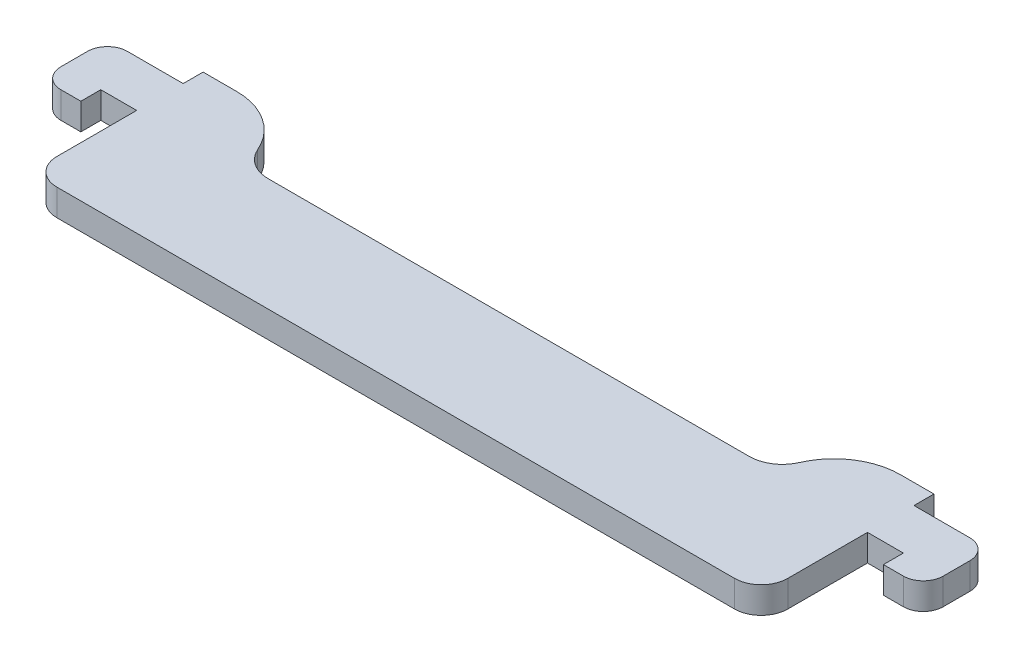
ISO-10303-21;
HEADER;
FILE_DESCRIPTION(('STEP AP214'),'2;1');
FILE_NAME('part.step','',(''),(''),'','','');
FILE_SCHEMA(('AUTOMOTIVE_DESIGN { 1 0 10303 214 1 1 1 1 }'));
ENDSEC;
DATA;
#1=APPLICATION_CONTEXT('core data for automotive mechanical design processes');
#2=APPLICATION_PROTOCOL_DEFINITION('international standard','automotive_design',2000,#1);
#3=PRODUCT_CONTEXT('',#1,'mechanical');
#4=PRODUCT('Part','Part','',(#3));
#5=PRODUCT_RELATED_PRODUCT_CATEGORY('part','',(#4));
#6=PRODUCT_DEFINITION_FORMATION('','',#4);
#7=PRODUCT_DEFINITION_CONTEXT('part definition',#1,'design');
#8=PRODUCT_DEFINITION('design','',#6,#7);
#9=PRODUCT_DEFINITION_SHAPE('','',#8);
#10=(LENGTH_UNIT() NAMED_UNIT(*) SI_UNIT(.MILLI.,.METRE.));
#11=(NAMED_UNIT(*) PLANE_ANGLE_UNIT() SI_UNIT($,.RADIAN.));
#12=(NAMED_UNIT(*) SI_UNIT($,.STERADIAN.) SOLID_ANGLE_UNIT());
#13=UNCERTAINTY_MEASURE_WITH_UNIT(LENGTH_MEASURE(1.E-05),#10,'distance_accuracy_value','');
#14=(GEOMETRIC_REPRESENTATION_CONTEXT(3) GLOBAL_UNCERTAINTY_ASSIGNED_CONTEXT((#13)) GLOBAL_UNIT_ASSIGNED_CONTEXT((#10,
#11,#12)) REPRESENTATION_CONTEXT('',''));
#15=CARTESIAN_POINT('',(0.,0.,0.));
#16=DIRECTION('',(0.,0.,1.));
#17=DIRECTION('',(1.,0.,0.));
#18=AXIS2_PLACEMENT_3D('',#15,#16,#17);
#19=CARTESIAN_POINT('',(0.,4.,-23.));
#20=DIRECTION('',(0.,0.,1.));
#21=DIRECTION('',(1.,0.,0.));
#22=AXIS2_PLACEMENT_3D('',#19,#20,#21);
#23=PLANE('',#22);
#24=DIRECTION('',(-1.,0.,0.));
#25=VECTOR('',#24,1.);
#26=CARTESIAN_POINT('',(0.,0.,-23.));
#27=LINE('',#26,#25);
#28=CARTESIAN_POINT('',(0.,0.,-23.));
#29=VERTEX_POINT('',#28);
#30=CARTESIAN_POINT('',(-8.4,0.,-23.));
#31=VERTEX_POINT('',#30);
#32=EDGE_CURVE('E282',#29,#31,#27,.T.);
#33=ORIENTED_EDGE('',*,*,#32,.T.);
#34=DIRECTION('',(0.,-1.,0.));
#35=VECTOR('',#34,1.);
#36=CARTESIAN_POINT('',(-8.4,4.,-23.));
#37=LINE('',#36,#35);
#38=CARTESIAN_POINT('',(-8.4,4.,-23.));
#39=VERTEX_POINT('',#38);
#40=EDGE_CURVE('E396',#31,#39,#37,.F.);
#41=ORIENTED_EDGE('',*,*,#40,.T.);
#42=DIRECTION('',(-1.,0.,0.));
#43=VECTOR('',#42,1.);
#44=CARTESIAN_POINT('',(0.,4.,-23.));
#45=LINE('',#44,#43);
#46=CARTESIAN_POINT('',(0.,4.,-23.));
#47=VERTEX_POINT('',#46);
#48=EDGE_CURVE('E325',#47,#39,#45,.T.);
#49=ORIENTED_EDGE('',*,*,#48,.F.);
#50=DIRECTION('',(0.,-1.,0.));
#51=VECTOR('',#50,1.);
#52=CARTESIAN_POINT('',(0.,4.,-23.));
#53=LINE('',#52,#51);
#54=EDGE_CURVE('E281',#47,#29,#53,.T.);
#55=ORIENTED_EDGE('',*,*,#54,.T.);
#56=EDGE_LOOP('',(#33,#41,#49,#55));
#57=FACE_BOUND('',#56,.T.);
#58=ADVANCED_FACE('F36',(#57),#23,.F.);
#59=CARTESIAN_POINT('',(-11.4,4.,-23.));
#60=DIRECTION('',(1.,0.,0.));
#61=DIRECTION('',(0.,0.,-1.));
#62=AXIS2_PLACEMENT_3D('',#59,#60,#61);
#63=PLANE('',#62);
#64=DIRECTION('',(0.,0.,1.));
#65=VECTOR('',#64,1.);
#66=CARTESIAN_POINT('',(-11.4,0.,-23.));
#67=LINE('',#66,#65);
#68=CARTESIAN_POINT('',(-11.4,0.,-20.));
#69=VERTEX_POINT('',#68);
#70=CARTESIAN_POINT('',(-11.4,0.,-16.));
#71=VERTEX_POINT('',#70);
#72=EDGE_CURVE('E285',#69,#71,#67,.T.);
#73=ORIENTED_EDGE('',*,*,#72,.T.);
#74=DIRECTION('',(0.,-1.,0.));
#75=VECTOR('',#74,1.);
#76=CARTESIAN_POINT('',(-11.4,4.,-16.));
#77=LINE('',#76,#75);
#78=CARTESIAN_POINT('',(-11.4,4.,-16.));
#79=VERTEX_POINT('',#78);
#80=EDGE_CURVE('E391',#71,#79,#77,.F.);
#81=ORIENTED_EDGE('',*,*,#80,.T.);
#82=DIRECTION('',(0.,0.,1.));
#83=VECTOR('',#82,1.);
#84=CARTESIAN_POINT('',(-11.4,4.,-23.));
#85=LINE('',#84,#83);
#86=CARTESIAN_POINT('',(-11.4,4.,-20.));
#87=VERTEX_POINT('',#86);
#88=EDGE_CURVE('E231',#87,#79,#85,.T.);
#89=ORIENTED_EDGE('',*,*,#88,.F.);
#90=DIRECTION('',(0.,-1.,0.));
#91=VECTOR('',#90,1.);
#92=CARTESIAN_POINT('',(-11.4,4.,-20.));
#93=LINE('',#92,#91);
#94=EDGE_CURVE('E388',#87,#69,#93,.T.);
#95=ORIENTED_EDGE('',*,*,#94,.T.);
#96=EDGE_LOOP('',(#73,#81,#89,#95));
#97=FACE_BOUND('',#96,.T.);
#98=ADVANCED_FACE('F461',(#97),#63,.F.);
#99=CARTESIAN_POINT('',(-11.4,4.,-13.));
#100=DIRECTION('',(0.,0.,-1.));
#101=DIRECTION('',(-1.,0.,0.));
#102=AXIS2_PLACEMENT_3D('',#99,#100,#101);
#103=PLANE('',#102);
#104=DIRECTION('',(1.,0.,0.));
#105=VECTOR('',#104,1.);
#106=CARTESIAN_POINT('',(-11.4,4.,-13.));
#107=LINE('',#106,#105);
#108=CARTESIAN_POINT('',(-8.4,4.,-13.));
#109=VERTEX_POINT('',#108);
#110=CARTESIAN_POINT('',(-5.4,4.,-13.));
#111=VERTEX_POINT('',#110);
#112=EDGE_CURVE('E218',#109,#111,#107,.T.);
#113=ORIENTED_EDGE('',*,*,#112,.F.);
#114=DIRECTION('',(0.,-1.,0.));
#115=VECTOR('',#114,1.);
#116=CARTESIAN_POINT('',(-8.4,4.,-13.));
#117=LINE('',#116,#115);
#118=CARTESIAN_POINT('',(-8.4,0.,-13.));
#119=VERTEX_POINT('',#118);
#120=EDGE_CURVE('E382',#109,#119,#117,.T.);
#121=ORIENTED_EDGE('',*,*,#120,.T.);
#122=DIRECTION('',(1.,0.,0.));
#123=VECTOR('',#122,1.);
#124=CARTESIAN_POINT('',(-11.4,0.,-13.));
#125=LINE('',#124,#123);
#126=CARTESIAN_POINT('',(-5.4,0.,-13.));
#127=VERTEX_POINT('',#126);
#128=EDGE_CURVE('E237',#119,#127,#125,.T.);
#129=ORIENTED_EDGE('',*,*,#128,.T.);
#130=DIRECTION('',(0.,-1.,0.));
#131=VECTOR('',#130,1.);
#132=CARTESIAN_POINT('',(-5.4,4.,-13.));
#133=LINE('',#132,#131);
#134=EDGE_CURVE('E234',#111,#127,#133,.T.);
#135=ORIENTED_EDGE('',*,*,#134,.F.);
#136=EDGE_LOOP('',(#113,#121,#129,#135));
#137=FACE_BOUND('',#136,.T.);
#138=ADVANCED_FACE('F235',(#137),#103,.F.);
#139=CARTESIAN_POINT('',(-5.4,4.,-13.));
#140=DIRECTION('',(-1.,0.,0.));
#141=DIRECTION('',(0.,0.,1.));
#142=AXIS2_PLACEMENT_3D('',#139,#140,#141);
#143=PLANE('',#142);
#144=DIRECTION('',(0.,0.,-1.));
#145=VECTOR('',#144,1.);
#146=CARTESIAN_POINT('',(-5.4,0.,-13.));
#147=LINE('',#146,#145);
#148=CARTESIAN_POINT('',(-5.4,0.,-16.));
#149=VERTEX_POINT('',#148);
#150=EDGE_CURVE('E289',#127,#149,#147,.T.);
#151=ORIENTED_EDGE('',*,*,#150,.T.);
#152=DIRECTION('',(0.,-1.,0.));
#153=VECTOR('',#152,1.);
#154=CARTESIAN_POINT('',(-5.4,4.,-16.));
#155=LINE('',#154,#153);
#156=CARTESIAN_POINT('',(-5.4,4.,-16.));
#157=VERTEX_POINT('',#156);
#158=EDGE_CURVE('E241',#157,#149,#155,.T.);
#159=ORIENTED_EDGE('',*,*,#158,.F.);
#160=DIRECTION('',(0.,0.,-1.));
#161=VECTOR('',#160,1.);
#162=CARTESIAN_POINT('',(-5.4,4.,-13.));
#163=LINE('',#162,#161);
#164=EDGE_CURVE('E223',#111,#157,#163,.T.);
#165=ORIENTED_EDGE('',*,*,#164,.F.);
#166=ORIENTED_EDGE('',*,*,#134,.T.);
#167=EDGE_LOOP('',(#151,#159,#165,#166));
#168=FACE_BOUND('',#167,.T.);
#169=ADVANCED_FACE('F243',(#168),#143,.F.);
#170=CARTESIAN_POINT('',(-5.4,4.,-16.));
#171=DIRECTION('',(0.,0.,-1.));
#172=DIRECTION('',(-1.,0.,0.));
#173=AXIS2_PLACEMENT_3D('',#170,#171,#172);
#174=PLANE('',#173);
#175=DIRECTION('',(1.,0.,0.));
#176=VECTOR('',#175,1.);
#177=CARTESIAN_POINT('',(-5.4,0.,-16.));
#178=LINE('',#177,#176);
#179=CARTESIAN_POINT('',(0.,0.,-16.));
#180=VERTEX_POINT('',#179);
#181=EDGE_CURVE('E291',#149,#180,#178,.T.);
#182=ORIENTED_EDGE('',*,*,#181,.T.);
#183=DIRECTION('',(0.,-1.,0.));
#184=VECTOR('',#183,1.);
#185=CARTESIAN_POINT('',(0.,4.,-16.));
#186=LINE('',#185,#184);
#187=CARTESIAN_POINT('',(0.,4.,-16.));
#188=VERTEX_POINT('',#187);
#189=EDGE_CURVE('E346',#188,#180,#186,.T.);
#190=ORIENTED_EDGE('',*,*,#189,.F.);
#191=DIRECTION('',(1.,0.,0.));
#192=VECTOR('',#191,1.);
#193=CARTESIAN_POINT('',(-5.4,4.,-16.));
#194=LINE('',#193,#192);
#195=EDGE_CURVE('E246',#157,#188,#194,.T.);
#196=ORIENTED_EDGE('',*,*,#195,.F.);
#197=ORIENTED_EDGE('',*,*,#158,.T.);
#198=EDGE_LOOP('',(#182,#190,#196,#197));
#199=FACE_BOUND('',#198,.T.);
#200=ADVANCED_FACE('F586',(#199),#174,.F.);
#201=CARTESIAN_POINT('',(0.,4.,-16.));
#202=DIRECTION('',(1.,0.,0.));
#203=DIRECTION('',(0.,0.,-1.));
#204=AXIS2_PLACEMENT_3D('',#201,#202,#203);
#205=PLANE('',#204);
#206=DIRECTION('',(0.,0.,1.));
#207=VECTOR('',#206,1.);
#208=CARTESIAN_POINT('',(0.,0.,-16.));
#209=LINE('',#208,#207);
#210=CARTESIAN_POINT('',(0.,0.,-4.));
#211=VERTEX_POINT('',#210);
#212=EDGE_CURVE('E293',#180,#211,#209,.T.);
#213=ORIENTED_EDGE('',*,*,#212,.T.);
#214=DIRECTION('',(0.,-1.,0.));
#215=VECTOR('',#214,1.);
#216=CARTESIAN_POINT('',(0.,4.,-4.));
#217=LINE('',#216,#215);
#218=CARTESIAN_POINT('',(0.,4.,-4.));
#219=VERTEX_POINT('',#218);
#220=EDGE_CURVE('E373',#211,#219,#217,.F.);
#221=ORIENTED_EDGE('',*,*,#220,.T.);
#222=DIRECTION('',(0.,0.,1.));
#223=VECTOR('',#222,1.);
#224=CARTESIAN_POINT('',(0.,4.,-16.));
#225=LINE('',#224,#223);
#226=EDGE_CURVE('E248',#188,#219,#225,.T.);
#227=ORIENTED_EDGE('',*,*,#226,.F.);
#228=ORIENTED_EDGE('',*,*,#189,.T.);
#229=EDGE_LOOP('',(#213,#221,#227,#228));
#230=FACE_BOUND('',#229,.T.);
#231=ADVANCED_FACE('F583',(#230),#205,.F.);
#232=CARTESIAN_POINT('',(0.,4.,0.));
#233=DIRECTION('',(0.,0.,-1.));
#234=DIRECTION('',(-1.,0.,0.));
#235=AXIS2_PLACEMENT_3D('',#232,#233,#234);
#236=PLANE('',#235);
#237=DIRECTION('',(1.,0.,0.));
#238=VECTOR('',#237,1.);
#239=CARTESIAN_POINT('',(0.,4.,0.));
#240=LINE('',#239,#238);
#241=CARTESIAN_POINT('',(4.,4.,0.));
#242=VERTEX_POINT('',#241);
#243=CARTESIAN_POINT('',(106.,4.,0.));
#244=VERTEX_POINT('',#243);
#245=EDGE_CURVE('E254',#242,#244,#240,.T.);
#246=ORIENTED_EDGE('',*,*,#245,.F.);
#247=DIRECTION('',(0.,-1.,0.));
#248=VECTOR('',#247,1.);
#249=CARTESIAN_POINT('',(4.,4.,0.));
#250=LINE('',#249,#248);
#251=CARTESIAN_POINT('',(4.,0.,0.));
#252=VERTEX_POINT('',#251);
#253=EDGE_CURVE('E366',#242,#252,#250,.T.);
#254=ORIENTED_EDGE('',*,*,#253,.T.);
#255=DIRECTION('',(1.,0.,0.));
#256=VECTOR('',#255,1.);
#257=CARTESIAN_POINT('',(0.,0.,0.));
#258=LINE('',#257,#256);
#259=CARTESIAN_POINT('',(106.,0.,0.));
#260=VERTEX_POINT('',#259);
#261=EDGE_CURVE('E296',#252,#260,#258,.T.);
#262=ORIENTED_EDGE('',*,*,#261,.T.);
#263=DIRECTION('',(0.,-1.,0.));
#264=VECTOR('',#263,1.);
#265=CARTESIAN_POINT('',(106.,4.,0.));
#266=LINE('',#265,#264);
#267=EDGE_CURVE('E364',#260,#244,#266,.F.);
#268=ORIENTED_EDGE('',*,*,#267,.T.);
#269=EDGE_LOOP('',(#246,#254,#262,#268));
#270=FACE_BOUND('',#269,.T.);
#271=ADVANCED_FACE('F503',(#270),#236,.F.);
#272=CARTESIAN_POINT('',(110.,4.,0.));
#273=DIRECTION('',(-1.,0.,0.));
#274=DIRECTION('',(0.,0.,1.));
#275=AXIS2_PLACEMENT_3D('',#272,#273,#274);
#276=PLANE('',#275);
#277=DIRECTION('',(0.,0.,-1.));
#278=VECTOR('',#277,1.);
#279=CARTESIAN_POINT('',(110.,4.,0.));
#280=LINE('',#279,#278);
#281=CARTESIAN_POINT('',(110.,4.,-4.));
#282=VERTEX_POINT('',#281);
#283=CARTESIAN_POINT('',(110.,4.,-16.));
#284=VERTEX_POINT('',#283);
#285=EDGE_CURVE('E257',#282,#284,#280,.T.);
#286=ORIENTED_EDGE('',*,*,#285,.F.);
#287=DIRECTION('',(0.,-1.,0.));
#288=VECTOR('',#287,1.);
#289=CARTESIAN_POINT('',(110.,4.,-4.));
#290=LINE('',#289,#288);
#291=CARTESIAN_POINT('',(110.,0.,-4.));
#292=VERTEX_POINT('',#291);
#293=EDGE_CURVE('E379',#282,#292,#290,.T.);
#294=ORIENTED_EDGE('',*,*,#293,.T.);
#295=DIRECTION('',(0.,0.,-1.));
#296=VECTOR('',#295,1.);
#297=CARTESIAN_POINT('',(110.,0.,0.));
#298=LINE('',#297,#296);
#299=CARTESIAN_POINT('',(110.,0.,-16.));
#300=VERTEX_POINT('',#299);
#301=EDGE_CURVE('E299',#292,#300,#298,.T.);
#302=ORIENTED_EDGE('',*,*,#301,.T.);
#303=DIRECTION('',(0.,-1.,0.));
#304=VECTOR('',#303,1.);
#305=CARTESIAN_POINT('',(110.,4.,-16.));
#306=LINE('',#305,#304);
#307=EDGE_CURVE('E343',#284,#300,#306,.T.);
#308=ORIENTED_EDGE('',*,*,#307,.F.);
#309=EDGE_LOOP('',(#286,#294,#302,#308));
#310=FACE_BOUND('',#309,.T.);
#311=ADVANCED_FACE('F510',(#310),#276,.F.);
#312=CARTESIAN_POINT('',(110.,4.,-16.));
#313=DIRECTION('',(0.,0.,-1.));
#314=DIRECTION('',(-1.,0.,0.));
#315=AXIS2_PLACEMENT_3D('',#312,#313,#314);
#316=PLANE('',#315);
#317=DIRECTION('',(1.,0.,0.));
#318=VECTOR('',#317,1.);
#319=CARTESIAN_POINT('',(110.,0.,-16.));
#320=LINE('',#319,#318);
#321=CARTESIAN_POINT('',(115.4,0.,-16.));
#322=VERTEX_POINT('',#321);
#323=EDGE_CURVE('E301',#300,#322,#320,.T.);
#324=ORIENTED_EDGE('',*,*,#323,.T.);
#325=DIRECTION('',(0.,-1.,0.));
#326=VECTOR('',#325,1.);
#327=CARTESIAN_POINT('',(115.4,4.,-16.));
#328=LINE('',#327,#326);
#329=CARTESIAN_POINT('',(115.4,4.,-16.));
#330=VERTEX_POINT('',#329);
#331=EDGE_CURVE('E340',#330,#322,#328,.T.);
#332=ORIENTED_EDGE('',*,*,#331,.F.);
#333=DIRECTION('',(1.,0.,0.));
#334=VECTOR('',#333,1.);
#335=CARTESIAN_POINT('',(110.,4.,-16.));
#336=LINE('',#335,#334);
#337=EDGE_CURVE('E259',#284,#330,#336,.T.);
#338=ORIENTED_EDGE('',*,*,#337,.F.);
#339=ORIENTED_EDGE('',*,*,#307,.T.);
#340=EDGE_LOOP('',(#324,#332,#338,#339));
#341=FACE_BOUND('',#340,.T.);
#342=ADVANCED_FACE('F516',(#341),#316,.F.);
#343=CARTESIAN_POINT('',(115.4,4.,-16.));
#344=DIRECTION('',(1.,0.,0.));
#345=DIRECTION('',(0.,0.,-1.));
#346=AXIS2_PLACEMENT_3D('',#343,#344,#345);
#347=PLANE('',#346);
#348=DIRECTION('',(0.,0.,1.));
#349=VECTOR('',#348,1.);
#350=CARTESIAN_POINT('',(115.4,0.,-16.));
#351=LINE('',#350,#349);
#352=CARTESIAN_POINT('',(115.4,0.,-13.));
#353=VERTEX_POINT('',#352);
#354=EDGE_CURVE('E303',#322,#353,#351,.T.);
#355=ORIENTED_EDGE('',*,*,#354,.T.);
#356=DIRECTION('',(0.,-1.,0.));
#357=VECTOR('',#356,1.);
#358=CARTESIAN_POINT('',(115.4,4.,-13.));
#359=LINE('',#358,#357);
#360=CARTESIAN_POINT('',(115.4,4.,-13.));
#361=VERTEX_POINT('',#360);
#362=EDGE_CURVE('E337',#361,#353,#359,.T.);
#363=ORIENTED_EDGE('',*,*,#362,.F.);
#364=DIRECTION('',(0.,0.,1.));
#365=VECTOR('',#364,1.);
#366=CARTESIAN_POINT('',(115.4,4.,-16.));
#367=LINE('',#366,#365);
#368=EDGE_CURVE('E261',#330,#361,#367,.T.);
#369=ORIENTED_EDGE('',*,*,#368,.F.);
#370=ORIENTED_EDGE('',*,*,#331,.T.);
#371=EDGE_LOOP('',(#355,#363,#369,#370));
#372=FACE_BOUND('',#371,.T.);
#373=ADVANCED_FACE('F522',(#372),#347,.F.);
#374=CARTESIAN_POINT('',(115.4,4.,-13.));
#375=DIRECTION('',(0.,0.,-1.));
#376=DIRECTION('',(-1.,0.,0.));
#377=AXIS2_PLACEMENT_3D('',#374,#375,#376);
#378=PLANE('',#377);
#379=DIRECTION('',(1.,0.,0.));
#380=VECTOR('',#379,1.);
#381=CARTESIAN_POINT('',(115.4,0.,-13.));
#382=LINE('',#381,#380);
#383=CARTESIAN_POINT('',(118.4,0.,-13.));
#384=VERTEX_POINT('',#383);
#385=EDGE_CURVE('E305',#353,#384,#382,.T.);
#386=ORIENTED_EDGE('',*,*,#385,.T.);
#387=DIRECTION('',(0.,-1.,0.));
#388=VECTOR('',#387,1.);
#389=CARTESIAN_POINT('',(118.4,4.,-13.));
#390=LINE('',#389,#388);
#391=CARTESIAN_POINT('',(118.4,4.,-13.));
#392=VERTEX_POINT('',#391);
#393=EDGE_CURVE('E407',#384,#392,#390,.F.);
#394=ORIENTED_EDGE('',*,*,#393,.T.);
#395=DIRECTION('',(1.,0.,0.));
#396=VECTOR('',#395,1.);
#397=CARTESIAN_POINT('',(115.4,4.,-13.));
#398=LINE('',#397,#396);
#399=EDGE_CURVE('E263',#361,#392,#398,.T.);
#400=ORIENTED_EDGE('',*,*,#399,.F.);
#401=ORIENTED_EDGE('',*,*,#362,.T.);
#402=EDGE_LOOP('',(#386,#394,#400,#401));
#403=FACE_BOUND('',#402,.T.);
#404=ADVANCED_FACE('F526',(#403),#378,.F.);
#405=CARTESIAN_POINT('',(121.4,4.,-13.));
#406=DIRECTION('',(-1.,0.,0.));
#407=DIRECTION('',(0.,0.,1.));
#408=AXIS2_PLACEMENT_3D('',#405,#406,#407);
#409=PLANE('',#408);
#410=DIRECTION('',(0.,0.,-1.));
#411=VECTOR('',#410,1.);
#412=CARTESIAN_POINT('',(121.4,4.,-13.));
#413=LINE('',#412,#411);
#414=CARTESIAN_POINT('',(121.4,4.,-16.));
#415=VERTEX_POINT('',#414);
#416=CARTESIAN_POINT('',(121.4,4.,-20.));
#417=VERTEX_POINT('',#416);
#418=EDGE_CURVE('E265',#415,#417,#413,.T.);
#419=ORIENTED_EDGE('',*,*,#418,.F.);
#420=DIRECTION('',(0.,-1.,0.));
#421=VECTOR('',#420,1.);
#422=CARTESIAN_POINT('',(121.4,4.,-16.));
#423=LINE('',#422,#421);
#424=CARTESIAN_POINT('',(121.4,0.,-16.));
#425=VERTEX_POINT('',#424);
#426=EDGE_CURVE('E400',#415,#425,#423,.T.);
#427=ORIENTED_EDGE('',*,*,#426,.T.);
#428=DIRECTION('',(0.,0.,-1.));
#429=VECTOR('',#428,1.);
#430=CARTESIAN_POINT('',(121.4,0.,-13.));
#431=LINE('',#430,#429);
#432=CARTESIAN_POINT('',(121.4,0.,-20.));
#433=VERTEX_POINT('',#432);
#434=EDGE_CURVE('E308',#425,#433,#431,.T.);
#435=ORIENTED_EDGE('',*,*,#434,.T.);
#436=DIRECTION('',(0.,-1.,0.));
#437=VECTOR('',#436,1.);
#438=CARTESIAN_POINT('',(121.4,4.,-20.));
#439=LINE('',#438,#437);
#440=EDGE_CURVE('E398',#433,#417,#439,.F.);
#441=ORIENTED_EDGE('',*,*,#440,.T.);
#442=EDGE_LOOP('',(#419,#427,#435,#441));
#443=FACE_BOUND('',#442,.T.);
#444=ADVANCED_FACE('F533',(#443),#409,.F.);
#445=CARTESIAN_POINT('',(121.4,4.,-23.));
#446=DIRECTION('',(0.,0.,1.));
#447=DIRECTION('',(1.,0.,0.));
#448=AXIS2_PLACEMENT_3D('',#445,#446,#447);
#449=PLANE('',#448);
#450=DIRECTION('',(-1.,0.,0.));
#451=VECTOR('',#450,1.);
#452=CARTESIAN_POINT('',(121.4,4.,-23.));
#453=LINE('',#452,#451);
#454=CARTESIAN_POINT('',(118.4,4.,-23.));
#455=VERTEX_POINT('',#454);
#456=CARTESIAN_POINT('',(110.,4.,-23.));
#457=VERTEX_POINT('',#456);
#458=EDGE_CURVE('E268',#455,#457,#453,.T.);
#459=ORIENTED_EDGE('',*,*,#458,.F.);
#460=DIRECTION('',(0.,-1.,0.));
#461=VECTOR('',#460,1.);
#462=CARTESIAN_POINT('',(118.4,4.,-23.));
#463=LINE('',#462,#461);
#464=CARTESIAN_POINT('',(118.4,0.,-23.));
#465=VERTEX_POINT('',#464);
#466=EDGE_CURVE('E413',#455,#465,#463,.T.);
#467=ORIENTED_EDGE('',*,*,#466,.T.);
#468=DIRECTION('',(-1.,0.,0.));
#469=VECTOR('',#468,1.);
#470=CARTESIAN_POINT('',(121.4,0.,-23.));
#471=LINE('',#470,#469);
#472=CARTESIAN_POINT('',(110.,0.,-23.));
#473=VERTEX_POINT('',#472);
#474=EDGE_CURVE('E311',#465,#473,#471,.T.);
#475=ORIENTED_EDGE('',*,*,#474,.T.);
#476=DIRECTION('',(0.,-1.,0.));
#477=VECTOR('',#476,1.);
#478=CARTESIAN_POINT('',(110.,4.,-23.));
#479=LINE('',#478,#477);
#480=EDGE_CURVE('E334',#457,#473,#479,.T.);
#481=ORIENTED_EDGE('',*,*,#480,.F.);
#482=EDGE_LOOP('',(#459,#467,#475,#481));
#483=FACE_BOUND('',#482,.T.);
#484=ADVANCED_FACE('F541',(#483),#449,.F.);
#485=CARTESIAN_POINT('',(110.,4.,-23.));
#486=DIRECTION('',(-1.,0.,0.));
#487=DIRECTION('',(0.,0.,1.));
#488=AXIS2_PLACEMENT_3D('',#485,#486,#487);
#489=PLANE('',#488);
#490=DIRECTION('',(0.,0.,-1.));
#491=VECTOR('',#490,1.);
#492=CARTESIAN_POINT('',(110.,0.,-23.));
#493=LINE('',#492,#491);
#494=CARTESIAN_POINT('',(110.,0.,-26.));
#495=VERTEX_POINT('',#494);
#496=EDGE_CURVE('E313',#473,#495,#493,.T.);
#497=ORIENTED_EDGE('',*,*,#496,.T.);
#498=DIRECTION('',(0.,-1.,0.));
#499=VECTOR('',#498,1.);
#500=CARTESIAN_POINT('',(110.,4.,-26.));
#501=LINE('',#500,#499);
#502=CARTESIAN_POINT('',(110.,4.,-26.));
#503=VERTEX_POINT('',#502);
#504=EDGE_CURVE('E331',#503,#495,#501,.T.);
#505=ORIENTED_EDGE('',*,*,#504,.F.);
#506=DIRECTION('',(0.,0.,-1.));
#507=VECTOR('',#506,1.);
#508=CARTESIAN_POINT('',(110.,4.,-23.));
#509=LINE('',#508,#507);
#510=EDGE_CURVE('E270',#457,#503,#509,.T.);
#511=ORIENTED_EDGE('',*,*,#510,.F.);
#512=ORIENTED_EDGE('',*,*,#480,.T.);
#513=EDGE_LOOP('',(#497,#505,#511,#512));
#514=FACE_BOUND('',#513,.T.);
#515=ADVANCED_FACE('F547',(#514),#489,.F.);
#516=CARTESIAN_POINT('',(110.,4.,-26.));
#517=DIRECTION('',(0.,0.,1.));
#518=DIRECTION('',(1.,0.,0.));
#519=AXIS2_PLACEMENT_3D('',#516,#517,#518);
#520=PLANE('',#519);
#521=DIRECTION('',(-1.,0.,0.));
#522=VECTOR('',#521,1.);
#523=CARTESIAN_POINT('',(110.,0.,-26.));
#524=LINE('',#523,#522);
#525=CARTESIAN_POINT('',(104.949874371066,0.,-26.));
#526=VERTEX_POINT('',#525);
#527=EDGE_CURVE('E315',#495,#526,#524,.T.);
#528=ORIENTED_EDGE('',*,*,#527,.T.);
#529=DIRECTION('',(0.,-1.,0.));
#530=VECTOR('',#529,1.);
#531=CARTESIAN_POINT('',(104.949874371066,4.,-26.));
#532=LINE('',#531,#530);
#533=CARTESIAN_POINT('',(104.949874371066,4.,-26.));
#534=VERTEX_POINT('',#533);
#535=EDGE_CURVE('E354',#526,#534,#532,.F.);
#536=ORIENTED_EDGE('',*,*,#535,.T.);
#537=DIRECTION('',(-1.,0.,0.));
#538=VECTOR('',#537,1.);
#539=CARTESIAN_POINT('',(110.,4.,-26.));
#540=LINE('',#539,#538);
#541=EDGE_CURVE('E272',#503,#534,#540,.T.);
#542=ORIENTED_EDGE('',*,*,#541,.F.);
#543=ORIENTED_EDGE('',*,*,#504,.T.);
#544=EDGE_LOOP('',(#528,#536,#542,#543));
#545=FACE_BOUND('',#544,.T.);
#546=ADVANCED_FACE('F558',(#545),#520,.F.);
#547=CARTESIAN_POINT('',(95.,4.,-17.));
#548=DIRECTION('',(0.,0.,1.));
#549=DIRECTION('',(1.,0.,0.));
#550=AXIS2_PLACEMENT_3D('',#547,#548,#549);
#551=PLANE('',#550);
#552=DIRECTION('',(-1.,0.,0.));
#553=VECTOR('',#552,1.);
#554=CARTESIAN_POINT('',(95.,4.,-17.));
#555=LINE('',#554,#553);
#556=CARTESIAN_POINT('',(91.2021472861987,4.,-17.));
#557=VERTEX_POINT('',#556);
#558=CARTESIAN_POINT('',(18.7978527138013,4.,-17.));
#559=VERTEX_POINT('',#558);
#560=EDGE_CURVE('E275',#557,#559,#555,.T.);
#561=ORIENTED_EDGE('',*,*,#560,.F.);
#562=DIRECTION('',(0.,-1.,0.));
#563=VECTOR('',#562,1.);
#564=CARTESIAN_POINT('',(91.2021472861987,4.,-17.));
#565=LINE('',#564,#563);
#566=CARTESIAN_POINT('',(91.2021472861987,0.,-17.));
#567=VERTEX_POINT('',#566);
#568=EDGE_CURVE('E418',#557,#567,#565,.T.);
#569=ORIENTED_EDGE('',*,*,#568,.T.);
#570=DIRECTION('',(-1.,0.,0.));
#571=VECTOR('',#570,1.);
#572=CARTESIAN_POINT('',(95.,0.,-17.));
#573=LINE('',#572,#571);
#574=CARTESIAN_POINT('',(18.7978527138013,0.,-17.));
#575=VERTEX_POINT('',#574);
#576=EDGE_CURVE('E318',#567,#575,#573,.T.);
#577=ORIENTED_EDGE('',*,*,#576,.T.);
#578=DIRECTION('',(0.,1.,0.));
#579=VECTOR('',#578,1.);
#580=CARTESIAN_POINT('',(18.7978527138013,4.,-17.));
#581=LINE('',#580,#579);
#582=EDGE_CURVE('E416',#575,#559,#581,.T.);
#583=ORIENTED_EDGE('',*,*,#582,.T.);
#584=EDGE_LOOP('',(#561,#569,#577,#583));
#585=FACE_BOUND('',#584,.T.);
#586=ADVANCED_FACE('F435',(#585),#551,.F.);
#587=CARTESIAN_POINT('',(15.,4.,-26.));
#588=DIRECTION('',(0.,0.,1.));
#589=DIRECTION('',(1.,0.,0.));
#590=AXIS2_PLACEMENT_3D('',#587,#588,#589);
#591=PLANE('',#590);
#592=DIRECTION('',(-1.,0.,0.));
#593=VECTOR('',#592,1.);
#594=CARTESIAN_POINT('',(15.,4.,-26.));
#595=LINE('',#594,#593);
#596=CARTESIAN_POINT('',(5.05012562893379,4.,-26.));
#597=VERTEX_POINT('',#596);
#598=CARTESIAN_POINT('',(0.,4.,-26.));
#599=VERTEX_POINT('',#598);
#600=EDGE_CURVE('E277',#597,#599,#595,.T.);
#601=ORIENTED_EDGE('',*,*,#600,.F.);
#602=DIRECTION('',(0.,1.,0.));
#603=VECTOR('',#602,1.);
#604=CARTESIAN_POINT('',(5.05012562893379,4.,-26.));
#605=LINE('',#604,#603);
#606=CARTESIAN_POINT('',(5.05012562893379,0.,-26.));
#607=VERTEX_POINT('',#606);
#608=EDGE_CURVE('E361',#597,#607,#605,.F.);
#609=ORIENTED_EDGE('',*,*,#608,.T.);
#610=DIRECTION('',(-1.,0.,0.));
#611=VECTOR('',#610,1.);
#612=CARTESIAN_POINT('',(15.,0.,-26.));
#613=LINE('',#612,#611);
#614=CARTESIAN_POINT('',(0.,0.,-26.));
#615=VERTEX_POINT('',#614);
#616=EDGE_CURVE('E321',#607,#615,#613,.T.);
#617=ORIENTED_EDGE('',*,*,#616,.T.);
#618=DIRECTION('',(0.,-1.,0.));
#619=VECTOR('',#618,1.);
#620=CARTESIAN_POINT('',(0.,4.,-26.));
#621=LINE('',#620,#619);
#622=EDGE_CURVE('E328',#599,#615,#621,.T.);
#623=ORIENTED_EDGE('',*,*,#622,.F.);
#624=EDGE_LOOP('',(#601,#609,#617,#623));
#625=FACE_BOUND('',#624,.T.);
#626=ADVANCED_FACE('F443',(#625),#591,.F.);
#627=CARTESIAN_POINT('',(0.,4.,-26.));
#628=DIRECTION('',(1.,0.,0.));
#629=DIRECTION('',(0.,0.,-1.));
#630=AXIS2_PLACEMENT_3D('',#627,#628,#629);
#631=PLANE('',#630);
#632=DIRECTION('',(0.,0.,1.));
#633=VECTOR('',#632,1.);
#634=CARTESIAN_POINT('',(0.,0.,-26.));
#635=LINE('',#634,#633);
#636=EDGE_CURVE('E323',#615,#29,#635,.T.);
#637=ORIENTED_EDGE('',*,*,#636,.T.);
#638=ORIENTED_EDGE('',*,*,#54,.F.);
#639=DIRECTION('',(0.,0.,1.));
#640=VECTOR('',#639,1.);
#641=CARTESIAN_POINT('',(0.,4.,-26.));
#642=LINE('',#641,#640);
#643=EDGE_CURVE('E279',#599,#47,#642,.T.);
#644=ORIENTED_EDGE('',*,*,#643,.F.);
#645=ORIENTED_EDGE('',*,*,#622,.T.);
#646=EDGE_LOOP('',(#637,#638,#644,#645));
#647=FACE_BOUND('',#646,.T.);
#648=ADVANCED_FACE('F448',(#647),#631,.F.);
#649=CARTESIAN_POINT('',(0.,4.,0.));
#650=DIRECTION('',(0.,1.,0.));
#651=DIRECTION('',(0.,0.,1.));
#652=AXIS2_PLACEMENT_3D('',#649,#650,#651);
#653=PLANE('',#652);
#654=ORIENTED_EDGE('',*,*,#399,.T.);
#655=CARTESIAN_POINT('',(118.4,4.,-16.));
#656=DIRECTION('',(0.,1.,0.));
#657=DIRECTION('',(0.,0.,1.));
#658=AXIS2_PLACEMENT_3D('',#655,#656,#657);
#659=CIRCLE('',#658,3.);
#660=EDGE_CURVE('E411',#392,#415,#659,.T.);
#661=ORIENTED_EDGE('',*,*,#660,.T.);
#662=ORIENTED_EDGE('',*,*,#418,.T.);
#663=CARTESIAN_POINT('',(118.4,4.,-20.));
#664=DIRECTION('',(0.,1.,0.));
#665=DIRECTION('',(0.,0.,1.));
#666=AXIS2_PLACEMENT_3D('',#663,#664,#665);
#667=CIRCLE('',#666,3.);
#668=EDGE_CURVE('E409',#417,#455,#667,.T.);
#669=ORIENTED_EDGE('',*,*,#668,.T.);
#670=ORIENTED_EDGE('',*,*,#458,.T.);
#671=ORIENTED_EDGE('',*,*,#510,.T.);
#672=ORIENTED_EDGE('',*,*,#541,.T.);
#673=CARTESIAN_POINT('',(104.949874371066,4.,-16.));
#674=DIRECTION('',(0.,1.,0.));
#675=DIRECTION('',(0.,0.,1.));
#676=AXIS2_PLACEMENT_3D('',#673,#674,#675);
#677=CIRCLE('',#676,10.);
#678=CARTESIAN_POINT('',(95.7847229811545,4.,-20.));
#679=VERTEX_POINT('',#678);
#680=EDGE_CURVE('E358',#534,#679,#677,.T.);
#681=ORIENTED_EDGE('',*,*,#680,.T.);
#682=CARTESIAN_POINT('',(91.2021472861987,4.,-22.));
#683=DIRECTION('',(0.,1.,0.));
#684=DIRECTION('',(0.,0.,1.));
#685=AXIS2_PLACEMENT_3D('',#682,#683,#684);
#686=CIRCLE('',#685,5.);
#687=EDGE_CURVE('E427',#679,#557,#686,.F.);
#688=ORIENTED_EDGE('',*,*,#687,.T.);
#689=ORIENTED_EDGE('',*,*,#560,.T.);
#690=CARTESIAN_POINT('',(18.7978527138013,4.,-22.));
#691=DIRECTION('',(0.,1.,0.));
#692=DIRECTION('',(0.,0.,1.));
#693=AXIS2_PLACEMENT_3D('',#690,#691,#692);
#694=CIRCLE('',#693,5.);
#695=CARTESIAN_POINT('',(14.2152770188455,4.,-20.));
#696=VERTEX_POINT('',#695);
#697=EDGE_CURVE('E11',#559,#696,#694,.F.);
#698=ORIENTED_EDGE('',*,*,#697,.T.);
#699=CARTESIAN_POINT('',(5.0501256289338,4.,-16.));
#700=DIRECTION('',(0.,1.,0.));
#701=DIRECTION('',(0.,0.,1.));
#702=AXIS2_PLACEMENT_3D('',#699,#700,#701);
#703=CIRCLE('',#702,10.);
#704=EDGE_CURVE('E356',#696,#597,#703,.T.);
#705=ORIENTED_EDGE('',*,*,#704,.T.);
#706=ORIENTED_EDGE('',*,*,#600,.T.);
#707=ORIENTED_EDGE('',*,*,#643,.T.);
#708=ORIENTED_EDGE('',*,*,#48,.T.);
#709=CARTESIAN_POINT('',(-8.40000000000001,4.,-20.));
#710=DIRECTION('',(0.,1.,0.));
#711=DIRECTION('',(0.,0.,1.));
#712=AXIS2_PLACEMENT_3D('',#709,#710,#711);
#713=CIRCLE('',#712,3.);
#714=EDGE_CURVE('E393',#39,#87,#713,.T.);
#715=ORIENTED_EDGE('',*,*,#714,.T.);
#716=ORIENTED_EDGE('',*,*,#88,.T.);
#717=CARTESIAN_POINT('',(-8.4,4.,-16.));
#718=DIRECTION('',(0.,1.,0.));
#719=DIRECTION('',(0.,0.,1.));
#720=AXIS2_PLACEMENT_3D('',#717,#718,#719);
#721=CIRCLE('',#720,3.);
#722=EDGE_CURVE('E227',#79,#109,#721,.T.);
#723=ORIENTED_EDGE('',*,*,#722,.T.);
#724=ORIENTED_EDGE('',*,*,#112,.T.);
#725=ORIENTED_EDGE('',*,*,#164,.T.);
#726=ORIENTED_EDGE('',*,*,#195,.T.);
#727=ORIENTED_EDGE('',*,*,#226,.T.);
#728=CARTESIAN_POINT('',(4.,4.,-4.));
#729=DIRECTION('',(0.,1.,0.));
#730=DIRECTION('',(0.,0.,1.));
#731=AXIS2_PLACEMENT_3D('',#728,#729,#730);
#732=CIRCLE('',#731,4.);
#733=EDGE_CURVE('E377',#219,#242,#732,.T.);
#734=ORIENTED_EDGE('',*,*,#733,.T.);
#735=ORIENTED_EDGE('',*,*,#245,.T.);
#736=CARTESIAN_POINT('',(106.,4.,-4.));
#737=DIRECTION('',(0.,1.,0.));
#738=DIRECTION('',(0.,0.,1.));
#739=AXIS2_PLACEMENT_3D('',#736,#737,#738);
#740=CIRCLE('',#739,4.);
#741=EDGE_CURVE('E375',#244,#282,#740,.T.);
#742=ORIENTED_EDGE('',*,*,#741,.T.);
#743=ORIENTED_EDGE('',*,*,#285,.T.);
#744=ORIENTED_EDGE('',*,*,#337,.T.);
#745=ORIENTED_EDGE('',*,*,#368,.T.);
#746=EDGE_LOOP('',(#654,#661,#662,#669,#670,#671,#672,#681,#688,#689,#698,#705,#706,#707,#708,
#715,#716,#723,#724,#725,#726,#727,#734,#735,#742,#743,#744,#745));
#747=FACE_BOUND('',#746,.T.);
#748=ADVANCED_FACE('F221',(#747),#653,.T.);
#749=CARTESIAN_POINT('',(0.,0.,0.));
#750=DIRECTION('',(0.,1.,0.));
#751=DIRECTION('',(0.,0.,1.));
#752=AXIS2_PLACEMENT_3D('',#749,#750,#751);
#753=PLANE('',#752);
#754=ORIENTED_EDGE('',*,*,#434,.F.);
#755=CARTESIAN_POINT('',(118.4,0.,-16.));
#756=DIRECTION('',(0.,1.,0.));
#757=DIRECTION('',(0.,0.,1.));
#758=AXIS2_PLACEMENT_3D('',#755,#756,#757);
#759=CIRCLE('',#758,3.);
#760=EDGE_CURVE('E405',#425,#384,#759,.F.);
#761=ORIENTED_EDGE('',*,*,#760,.T.);
#762=ORIENTED_EDGE('',*,*,#385,.F.);
#763=ORIENTED_EDGE('',*,*,#354,.F.);
#764=ORIENTED_EDGE('',*,*,#323,.F.);
#765=ORIENTED_EDGE('',*,*,#301,.F.);
#766=CARTESIAN_POINT('',(106.,0.,-4.));
#767=DIRECTION('',(0.,1.,0.));
#768=DIRECTION('',(0.,0.,1.));
#769=AXIS2_PLACEMENT_3D('',#766,#767,#768);
#770=CIRCLE('',#769,4.);
#771=EDGE_CURVE('E369',#292,#260,#770,.F.);
#772=ORIENTED_EDGE('',*,*,#771,.T.);
#773=ORIENTED_EDGE('',*,*,#261,.F.);
#774=CARTESIAN_POINT('',(4.,0.,-4.));
#775=DIRECTION('',(0.,1.,0.));
#776=DIRECTION('',(0.,0.,1.));
#777=AXIS2_PLACEMENT_3D('',#774,#775,#776);
#778=CIRCLE('',#777,4.);
#779=EDGE_CURVE('E371',#252,#211,#778,.F.);
#780=ORIENTED_EDGE('',*,*,#779,.T.);
#781=ORIENTED_EDGE('',*,*,#212,.F.);
#782=ORIENTED_EDGE('',*,*,#181,.F.);
#783=ORIENTED_EDGE('',*,*,#150,.F.);
#784=ORIENTED_EDGE('',*,*,#128,.F.);
#785=CARTESIAN_POINT('',(-8.4,0.,-16.));
#786=DIRECTION('',(0.,1.,0.));
#787=DIRECTION('',(0.,0.,1.));
#788=AXIS2_PLACEMENT_3D('',#785,#786,#787);
#789=CIRCLE('',#788,3.);
#790=EDGE_CURVE('E386',#119,#71,#789,.F.);
#791=ORIENTED_EDGE('',*,*,#790,.T.);
#792=ORIENTED_EDGE('',*,*,#72,.F.);
#793=CARTESIAN_POINT('',(-8.40000000000001,0.,-20.));
#794=DIRECTION('',(0.,1.,0.));
#795=DIRECTION('',(0.,0.,1.));
#796=AXIS2_PLACEMENT_3D('',#793,#794,#795);
#797=CIRCLE('',#796,3.);
#798=EDGE_CURVE('E384',#69,#31,#797,.F.);
#799=ORIENTED_EDGE('',*,*,#798,.T.);
#800=ORIENTED_EDGE('',*,*,#32,.F.);
#801=ORIENTED_EDGE('',*,*,#636,.F.);
#802=ORIENTED_EDGE('',*,*,#616,.F.);
#803=CARTESIAN_POINT('',(5.0501256289338,0.,-16.));
#804=DIRECTION('',(0.,1.,0.));
#805=DIRECTION('',(0.,0.,1.));
#806=AXIS2_PLACEMENT_3D('',#803,#804,#805);
#807=CIRCLE('',#806,10.);
#808=CARTESIAN_POINT('',(14.2152770188455,0.,-20.));
#809=VERTEX_POINT('',#808);
#810=EDGE_CURVE('E240',#607,#809,#807,.F.);
#811=ORIENTED_EDGE('',*,*,#810,.T.);
#812=CARTESIAN_POINT('',(18.7978527138013,0.,-22.));
#813=DIRECTION('',(0.,1.,0.));
#814=DIRECTION('',(0.,0.,1.));
#815=AXIS2_PLACEMENT_3D('',#812,#813,#814);
#816=CIRCLE('',#815,5.);
#817=EDGE_CURVE('E44',#809,#575,#816,.T.);
#818=ORIENTED_EDGE('',*,*,#817,.T.);
#819=ORIENTED_EDGE('',*,*,#576,.F.);
#820=CARTESIAN_POINT('',(91.2021472861987,0.,-22.));
#821=DIRECTION('',(0.,1.,0.));
#822=DIRECTION('',(0.,0.,1.));
#823=AXIS2_PLACEMENT_3D('',#820,#821,#822);
#824=CIRCLE('',#823,5.);
#825=CARTESIAN_POINT('',(95.7847229811545,0.,-20.));
#826=VERTEX_POINT('',#825);
#827=EDGE_CURVE('E425',#567,#826,#824,.T.);
#828=ORIENTED_EDGE('',*,*,#827,.T.);
#829=CARTESIAN_POINT('',(104.949874371066,0.,-16.));
#830=DIRECTION('',(0.,1.,0.));
#831=DIRECTION('',(0.,0.,1.));
#832=AXIS2_PLACEMENT_3D('',#829,#830,#831);
#833=CIRCLE('',#832,10.);
#834=EDGE_CURVE('E352',#826,#526,#833,.F.);
#835=ORIENTED_EDGE('',*,*,#834,.T.);
#836=ORIENTED_EDGE('',*,*,#527,.F.);
#837=ORIENTED_EDGE('',*,*,#496,.F.);
#838=ORIENTED_EDGE('',*,*,#474,.F.);
#839=CARTESIAN_POINT('',(118.4,0.,-20.));
#840=DIRECTION('',(0.,1.,0.));
#841=DIRECTION('',(0.,0.,1.));
#842=AXIS2_PLACEMENT_3D('',#839,#840,#841);
#843=CIRCLE('',#842,3.);
#844=EDGE_CURVE('E403',#465,#433,#843,.F.);
#845=ORIENTED_EDGE('',*,*,#844,.T.);
#846=EDGE_LOOP('',(#754,#761,#762,#763,#764,#765,#772,#773,#780,#781,#782,#783,#784,#791,#792,
#799,#800,#801,#802,#811,#818,#819,#828,#835,#836,#837,#838,#845));
#847=FACE_BOUND('',#846,.T.);
#848=ADVANCED_FACE('F431',(#847),#753,.F.);
#849=CARTESIAN_POINT('',(104.949874371066,4.,-16.));
#850=DIRECTION('',(0.,-1.,0.));
#851=DIRECTION('',(0.,0.,-1.));
#852=AXIS2_PLACEMENT_3D('',#849,#850,#851);
#853=CYLINDRICAL_SURFACE('',#852,10.);
#854=ORIENTED_EDGE('',*,*,#834,.F.);
#855=DIRECTION('',(0.,-1.,0.));
#856=VECTOR('',#855,1.);
#857=CARTESIAN_POINT('',(95.7847229811545,4.,-20.));
#858=LINE('',#857,#856);
#859=EDGE_CURVE('E421',#826,#679,#858,.F.);
#860=ORIENTED_EDGE('',*,*,#859,.T.);
#861=ORIENTED_EDGE('',*,*,#680,.F.);
#862=ORIENTED_EDGE('',*,*,#535,.F.);
#863=EDGE_LOOP('',(#854,#860,#861,#862));
#864=FACE_BOUND('',#863,.T.);
#865=ADVANCED_FACE('F486',(#864),#853,.T.);
#866=CARTESIAN_POINT('',(5.0501256289338,4.,-16.));
#867=DIRECTION('',(0.,1.,0.));
#868=DIRECTION('',(0.,0.,1.));
#869=AXIS2_PLACEMENT_3D('',#866,#867,#868);
#870=CYLINDRICAL_SURFACE('',#869,10.);
#871=ORIENTED_EDGE('',*,*,#704,.F.);
#872=DIRECTION('',(0.,1.,0.));
#873=VECTOR('',#872,1.);
#874=CARTESIAN_POINT('',(14.2152770188455,4.,-20.));
#875=LINE('',#874,#873);
#876=EDGE_CURVE('E423',#696,#809,#875,.F.);
#877=ORIENTED_EDGE('',*,*,#876,.T.);
#878=ORIENTED_EDGE('',*,*,#810,.F.);
#879=ORIENTED_EDGE('',*,*,#608,.F.);
#880=EDGE_LOOP('',(#871,#877,#878,#879));
#881=FACE_BOUND('',#880,.T.);
#882=ADVANCED_FACE('F438',(#881),#870,.T.);
#883=CARTESIAN_POINT('',(4.,4.,-4.));
#884=DIRECTION('',(0.,-1.,0.));
#885=DIRECTION('',(0.,0.,-1.));
#886=AXIS2_PLACEMENT_3D('',#883,#884,#885);
#887=CYLINDRICAL_SURFACE('',#886,4.);
#888=ORIENTED_EDGE('',*,*,#733,.F.);
#889=ORIENTED_EDGE('',*,*,#220,.F.);
#890=ORIENTED_EDGE('',*,*,#779,.F.);
#891=ORIENTED_EDGE('',*,*,#253,.F.);
#892=EDGE_LOOP('',(#888,#889,#890,#891));
#893=FACE_BOUND('',#892,.T.);
#894=ADVANCED_FACE('F475',(#893),#887,.T.);
#895=CARTESIAN_POINT('',(106.,4.,-4.));
#896=DIRECTION('',(0.,-1.,0.));
#897=DIRECTION('',(0.,0.,-1.));
#898=AXIS2_PLACEMENT_3D('',#895,#896,#897);
#899=CYLINDRICAL_SURFACE('',#898,4.);
#900=ORIENTED_EDGE('',*,*,#741,.F.);
#901=ORIENTED_EDGE('',*,*,#267,.F.);
#902=ORIENTED_EDGE('',*,*,#771,.F.);
#903=ORIENTED_EDGE('',*,*,#293,.F.);
#904=EDGE_LOOP('',(#900,#901,#902,#903));
#905=FACE_BOUND('',#904,.T.);
#906=ADVANCED_FACE('F467',(#905),#899,.T.);
#907=CARTESIAN_POINT('',(-8.4,4.,-16.));
#908=DIRECTION('',(0.,-1.,0.));
#909=DIRECTION('',(0.,0.,-1.));
#910=AXIS2_PLACEMENT_3D('',#907,#908,#909);
#911=CYLINDRICAL_SURFACE('',#910,3.);
#912=ORIENTED_EDGE('',*,*,#722,.F.);
#913=ORIENTED_EDGE('',*,*,#80,.F.);
#914=ORIENTED_EDGE('',*,*,#790,.F.);
#915=ORIENTED_EDGE('',*,*,#120,.F.);
#916=EDGE_LOOP('',(#912,#913,#914,#915));
#917=FACE_BOUND('',#916,.T.);
#918=ADVANCED_FACE('F465',(#917),#911,.T.);
#919=CARTESIAN_POINT('',(-8.40000000000001,4.,-20.));
#920=DIRECTION('',(0.,-1.,0.));
#921=DIRECTION('',(0.,0.,-1.));
#922=AXIS2_PLACEMENT_3D('',#919,#920,#921);
#923=CYLINDRICAL_SURFACE('',#922,3.);
#924=ORIENTED_EDGE('',*,*,#714,.F.);
#925=ORIENTED_EDGE('',*,*,#40,.F.);
#926=ORIENTED_EDGE('',*,*,#798,.F.);
#927=ORIENTED_EDGE('',*,*,#94,.F.);
#928=EDGE_LOOP('',(#924,#925,#926,#927));
#929=FACE_BOUND('',#928,.T.);
#930=ADVANCED_FACE('F458',(#929),#923,.T.);
#931=CARTESIAN_POINT('',(118.4,4.,-16.));
#932=DIRECTION('',(0.,-1.,0.));
#933=DIRECTION('',(0.,0.,-1.));
#934=AXIS2_PLACEMENT_3D('',#931,#932,#933);
#935=CYLINDRICAL_SURFACE('',#934,3.);
#936=ORIENTED_EDGE('',*,*,#660,.F.);
#937=ORIENTED_EDGE('',*,*,#393,.F.);
#938=ORIENTED_EDGE('',*,*,#760,.F.);
#939=ORIENTED_EDGE('',*,*,#426,.F.);
#940=EDGE_LOOP('',(#936,#937,#938,#939));
#941=FACE_BOUND('',#940,.T.);
#942=ADVANCED_FACE('F473',(#941),#935,.T.);
#943=CARTESIAN_POINT('',(118.4,4.,-20.));
#944=DIRECTION('',(0.,-1.,0.));
#945=DIRECTION('',(0.,0.,-1.));
#946=AXIS2_PLACEMENT_3D('',#943,#944,#945);
#947=CYLINDRICAL_SURFACE('',#946,3.);
#948=ORIENTED_EDGE('',*,*,#668,.F.);
#949=ORIENTED_EDGE('',*,*,#440,.F.);
#950=ORIENTED_EDGE('',*,*,#844,.F.);
#951=ORIENTED_EDGE('',*,*,#466,.F.);
#952=EDGE_LOOP('',(#948,#949,#950,#951));
#953=FACE_BOUND('',#952,.T.);
#954=ADVANCED_FACE('F536',(#953),#947,.T.);
#955=CARTESIAN_POINT('',(91.2021472861987,4.,-22.));
#956=DIRECTION('',(0.,-1.,0.));
#957=DIRECTION('',(0.,0.,-1.));
#958=AXIS2_PLACEMENT_3D('',#955,#956,#957);
#959=CYLINDRICAL_SURFACE('',#958,5.);
#960=ORIENTED_EDGE('',*,*,#687,.F.);
#961=ORIENTED_EDGE('',*,*,#859,.F.);
#962=ORIENTED_EDGE('',*,*,#827,.F.);
#963=ORIENTED_EDGE('',*,*,#568,.F.);
#964=EDGE_LOOP('',(#960,#961,#962,#963));
#965=FACE_BOUND('',#964,.T.);
#966=ADVANCED_FACE('F556',(#965),#959,.F.);
#967=CARTESIAN_POINT('',(18.7978527138013,4.,-22.));
#968=DIRECTION('',(0.,1.,0.));
#969=DIRECTION('',(0.,0.,1.));
#970=AXIS2_PLACEMENT_3D('',#967,#968,#969);
#971=CYLINDRICAL_SURFACE('',#970,5.);
#972=ORIENTED_EDGE('',*,*,#697,.F.);
#973=ORIENTED_EDGE('',*,*,#582,.F.);
#974=ORIENTED_EDGE('',*,*,#817,.F.);
#975=ORIENTED_EDGE('',*,*,#876,.F.);
#976=EDGE_LOOP('',(#972,#973,#974,#975));
#977=FACE_BOUND('',#976,.T.);
#978=ADVANCED_FACE('F38',(#977),#971,.F.);
#979=CLOSED_SHELL('',(#58,#98,#138,#169,#200,#231,#271,#311,#342,#373,#404,#444,#484,#515,#546,
#586,#626,#648,#748,#848,#865,#882,#894,#906,#918,#930,#942,#954,#966,#978));
#980=MANIFOLD_SOLID_BREP('B2',#979);
#981=ADVANCED_BREP_SHAPE_REPRESENTATION('',(#18,#980),#14);
#982=SHAPE_DEFINITION_REPRESENTATION(#9,#981);
ENDSEC;
END-ISO-10303-21;
